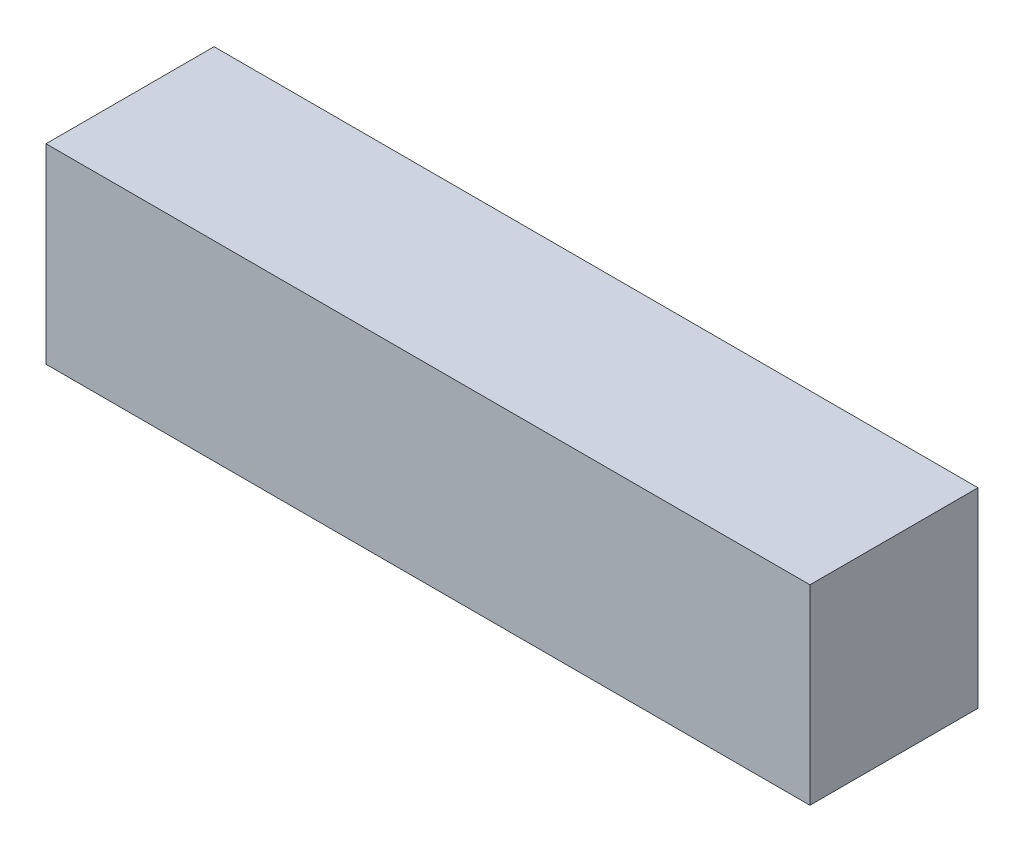
ISO-10303-21;
HEADER;
FILE_DESCRIPTION(('STEP AP214'),'2;1');
FILE_NAME('part.step','',(''),(''),'','','');
FILE_SCHEMA(('AUTOMOTIVE_DESIGN { 1 0 10303 214 1 1 1 1 }'));
ENDSEC;
DATA;
#1=APPLICATION_CONTEXT('core data for automotive mechanical design processes');
#2=APPLICATION_PROTOCOL_DEFINITION('international standard','automotive_design',2000,#1);
#3=PRODUCT_CONTEXT('',#1,'mechanical');
#4=PRODUCT('Part','Part','',(#3));
#5=PRODUCT_RELATED_PRODUCT_CATEGORY('part','',(#4));
#6=PRODUCT_DEFINITION_FORMATION('','',#4);
#7=PRODUCT_DEFINITION_CONTEXT('part definition',#1,'design');
#8=PRODUCT_DEFINITION('design','',#6,#7);
#9=PRODUCT_DEFINITION_SHAPE('','',#8);
#10=(LENGTH_UNIT() NAMED_UNIT(*) SI_UNIT(.MILLI.,.METRE.));
#11=(NAMED_UNIT(*) PLANE_ANGLE_UNIT() SI_UNIT($,.RADIAN.));
#12=(NAMED_UNIT(*) SI_UNIT($,.STERADIAN.) SOLID_ANGLE_UNIT());
#13=UNCERTAINTY_MEASURE_WITH_UNIT(LENGTH_MEASURE(1.E-05),#10,'distance_accuracy_value','');
#14=(GEOMETRIC_REPRESENTATION_CONTEXT(3) GLOBAL_UNCERTAINTY_ASSIGNED_CONTEXT((#13)) GLOBAL_UNIT_ASSIGNED_CONTEXT((#10,
#11,#12)) REPRESENTATION_CONTEXT('',''));
#15=CARTESIAN_POINT('',(0.,0.,0.));
#16=DIRECTION('',(0.,0.,1.));
#17=DIRECTION('',(1.,0.,0.));
#18=AXIS2_PLACEMENT_3D('',#15,#16,#17);
#19=CARTESIAN_POINT('',(0.,0.,2.794));
#20=DIRECTION('',(1.,0.,0.));
#21=DIRECTION('',(0.,0.,-1.));
#22=AXIS2_PLACEMENT_3D('',#19,#20,#21);
#23=PLANE('',#22);
#24=DIRECTION('',(0.,-1.,0.));
#25=VECTOR('',#24,1.);
#26=CARTESIAN_POINT('',(0.,0.,0.));
#27=LINE('',#26,#25);
#28=CARTESIAN_POINT('',(0.,3.175,0.));
#29=VERTEX_POINT('',#28);
#30=CARTESIAN_POINT('',(0.,0.,0.));
#31=VERTEX_POINT('',#30);
#32=EDGE_CURVE('E95',#29,#31,#27,.T.);
#33=ORIENTED_EDGE('',*,*,#32,.T.);
#34=DIRECTION('',(0.,0.,-1.));
#35=VECTOR('',#34,1.);
#36=CARTESIAN_POINT('',(0.,0.,2.794));
#37=LINE('',#36,#35);
#38=CARTESIAN_POINT('',(0.,0.,2.794));
#39=VERTEX_POINT('',#38);
#40=EDGE_CURVE('E11',#39,#31,#37,.T.);
#41=ORIENTED_EDGE('',*,*,#40,.F.);
#42=DIRECTION('',(0.,-1.,0.));
#43=VECTOR('',#42,1.);
#44=CARTESIAN_POINT('',(0.,0.,2.794));
#45=LINE('',#44,#43);
#46=CARTESIAN_POINT('',(0.,3.175,2.794));
#47=VERTEX_POINT('',#46);
#48=EDGE_CURVE('E83',#47,#39,#45,.T.);
#49=ORIENTED_EDGE('',*,*,#48,.F.);
#50=DIRECTION('',(0.,0.,-1.));
#51=VECTOR('',#50,1.);
#52=CARTESIAN_POINT('',(0.,3.175,2.794));
#53=LINE('',#52,#51);
#54=EDGE_CURVE('E91',#47,#29,#53,.T.);
#55=ORIENTED_EDGE('',*,*,#54,.T.);
#56=EDGE_LOOP('',(#33,#41,#49,#55));
#57=FACE_BOUND('',#56,.T.);
#58=ADVANCED_FACE('F32',(#57),#23,.F.);
#59=CARTESIAN_POINT('',(0.,0.,2.794));
#60=DIRECTION('',(0.,1.,0.));
#61=DIRECTION('',(0.,0.,1.));
#62=AXIS2_PLACEMENT_3D('',#59,#60,#61);
#63=PLANE('',#62);
#64=DIRECTION('',(1.,0.,0.));
#65=VECTOR('',#64,1.);
#66=CARTESIAN_POINT('',(0.,0.,0.));
#67=LINE('',#66,#65);
#68=CARTESIAN_POINT('',(12.7,0.,0.));
#69=VERTEX_POINT('',#68);
#70=EDGE_CURVE('E87',#31,#69,#67,.T.);
#71=ORIENTED_EDGE('',*,*,#70,.T.);
#72=DIRECTION('',(0.,0.,-1.));
#73=VECTOR('',#72,1.);
#74=CARTESIAN_POINT('',(12.7,0.,2.794));
#75=LINE('',#74,#73);
#76=CARTESIAN_POINT('',(12.7,0.,2.794));
#77=VERTEX_POINT('',#76);
#78=EDGE_CURVE('E40',#77,#69,#75,.T.);
#79=ORIENTED_EDGE('',*,*,#78,.F.);
#80=DIRECTION('',(1.,0.,0.));
#81=VECTOR('',#80,1.);
#82=CARTESIAN_POINT('',(0.,0.,2.794));
#83=LINE('',#82,#81);
#84=EDGE_CURVE('E78',#39,#77,#83,.T.);
#85=ORIENTED_EDGE('',*,*,#84,.F.);
#86=ORIENTED_EDGE('',*,*,#40,.T.);
#87=EDGE_LOOP('',(#71,#79,#85,#86));
#88=FACE_BOUND('',#87,.T.);
#89=ADVANCED_FACE('F86',(#88),#63,.F.);
#90=CARTESIAN_POINT('',(12.7,0.,2.794));
#91=DIRECTION('',(-1.,0.,0.));
#92=DIRECTION('',(0.,0.,1.));
#93=AXIS2_PLACEMENT_3D('',#90,#91,#92);
#94=PLANE('',#93);
#95=DIRECTION('',(0.,1.,0.));
#96=VECTOR('',#95,1.);
#97=CARTESIAN_POINT('',(12.7,0.,0.));
#98=LINE('',#97,#96);
#99=CARTESIAN_POINT('',(12.7,3.175,0.));
#100=VERTEX_POINT('',#99);
#101=EDGE_CURVE('E65',#69,#100,#98,.T.);
#102=ORIENTED_EDGE('',*,*,#101,.T.);
#103=DIRECTION('',(0.,0.,-1.));
#104=VECTOR('',#103,1.);
#105=CARTESIAN_POINT('',(12.7,3.175,2.794));
#106=LINE('',#105,#104);
#107=CARTESIAN_POINT('',(12.7,3.175,2.794));
#108=VERTEX_POINT('',#107);
#109=EDGE_CURVE('E88',#108,#100,#106,.T.);
#110=ORIENTED_EDGE('',*,*,#109,.F.);
#111=DIRECTION('',(0.,1.,0.));
#112=VECTOR('',#111,1.);
#113=CARTESIAN_POINT('',(12.7,0.,2.794));
#114=LINE('',#113,#112);
#115=EDGE_CURVE('E81',#77,#108,#114,.T.);
#116=ORIENTED_EDGE('',*,*,#115,.F.);
#117=ORIENTED_EDGE('',*,*,#78,.T.);
#118=EDGE_LOOP('',(#102,#110,#116,#117));
#119=FACE_BOUND('',#118,.T.);
#120=ADVANCED_FACE('F89',(#119),#94,.F.);
#121=CARTESIAN_POINT('',(0.,3.175,2.794));
#122=DIRECTION('',(0.,-1.,0.));
#123=DIRECTION('',(0.,0.,-1.));
#124=AXIS2_PLACEMENT_3D('',#121,#122,#123);
#125=PLANE('',#124);
#126=DIRECTION('',(-1.,0.,0.));
#127=VECTOR('',#126,1.);
#128=CARTESIAN_POINT('',(0.,3.175,0.));
#129=LINE('',#128,#127);
#130=EDGE_CURVE('E71',#100,#29,#129,.T.);
#131=ORIENTED_EDGE('',*,*,#130,.T.);
#132=ORIENTED_EDGE('',*,*,#54,.F.);
#133=DIRECTION('',(-1.,0.,0.));
#134=VECTOR('',#133,1.);
#135=CARTESIAN_POINT('',(0.,3.175,2.794));
#136=LINE('',#135,#134);
#137=EDGE_CURVE('E48',#108,#47,#136,.T.);
#138=ORIENTED_EDGE('',*,*,#137,.F.);
#139=ORIENTED_EDGE('',*,*,#109,.T.);
#140=EDGE_LOOP('',(#131,#132,#138,#139));
#141=FACE_BOUND('',#140,.T.);
#142=ADVANCED_FACE('F102',(#141),#125,.F.);
#143=CARTESIAN_POINT('',(0.,0.,2.794));
#144=DIRECTION('',(0.,0.,-1.));
#145=DIRECTION('',(-1.,0.,0.));
#146=AXIS2_PLACEMENT_3D('',#143,#144,#145);
#147=PLANE('',#146);
#148=ORIENTED_EDGE('',*,*,#48,.T.);
#149=ORIENTED_EDGE('',*,*,#84,.T.);
#150=ORIENTED_EDGE('',*,*,#115,.T.);
#151=ORIENTED_EDGE('',*,*,#137,.T.);
#152=EDGE_LOOP('',(#148,#149,#150,#151));
#153=FACE_BOUND('',#152,.T.);
#154=ADVANCED_FACE('F79',(#153),#147,.F.);
#155=CARTESIAN_POINT('',(0.,0.,0.));
#156=DIRECTION('',(0.,0.,-1.));
#157=DIRECTION('',(-1.,0.,0.));
#158=AXIS2_PLACEMENT_3D('',#155,#156,#157);
#159=PLANE('',#158);
#160=ORIENTED_EDGE('',*,*,#32,.F.);
#161=ORIENTED_EDGE('',*,*,#130,.F.);
#162=ORIENTED_EDGE('',*,*,#101,.F.);
#163=ORIENTED_EDGE('',*,*,#70,.F.);
#164=EDGE_LOOP('',(#160,#161,#162,#163));
#165=FACE_BOUND('',#164,.T.);
#166=ADVANCED_FACE('F105',(#165),#159,.T.);
#167=CLOSED_SHELL('',(#58,#89,#120,#142,#154,#166));
#168=MANIFOLD_SOLID_BREP('B2',#167);
#169=ADVANCED_BREP_SHAPE_REPRESENTATION('',(#18,#168),#14);
#170=SHAPE_DEFINITION_REPRESENTATION(#9,#169);
ENDSEC;
END-ISO-10303-21;
